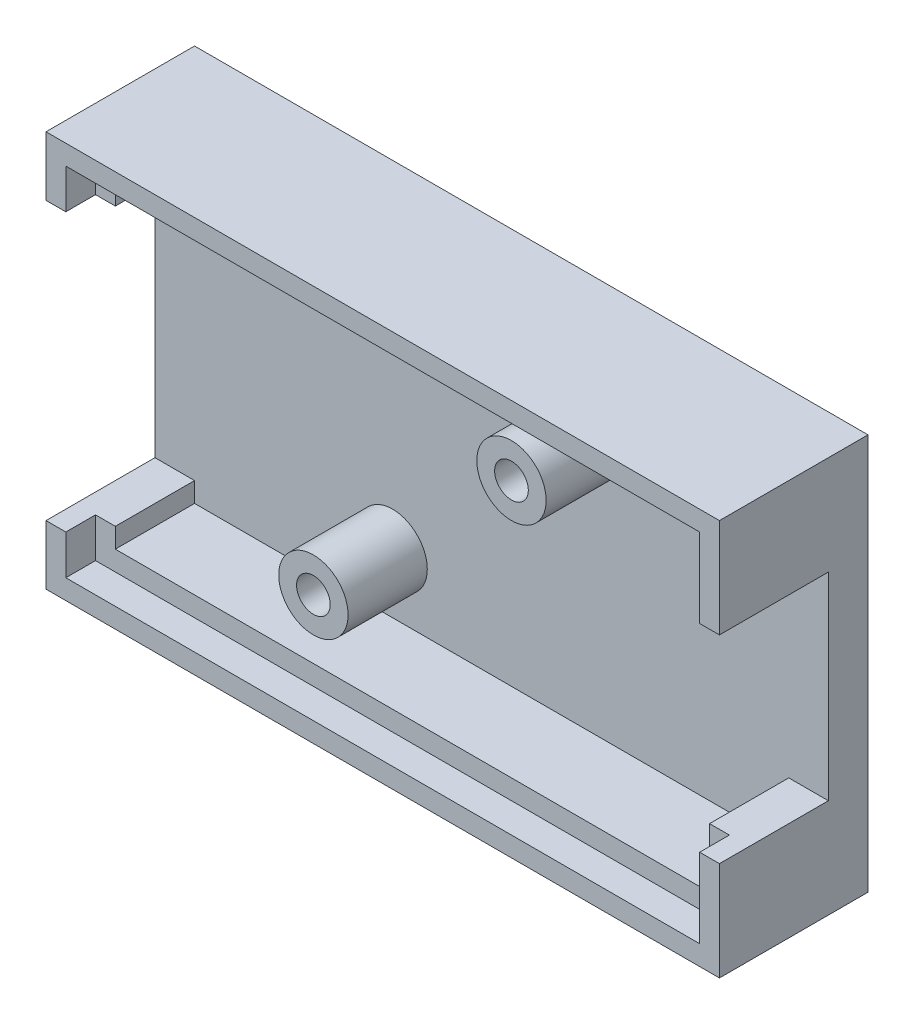
ISO-10303-21;
HEADER;
FILE_DESCRIPTION(('STEP AP214'),'2;1');
FILE_NAME('part.step','',(''),(''),'','','');
FILE_SCHEMA(('AUTOMOTIVE_DESIGN { 1 0 10303 214 1 1 1 1 }'));
ENDSEC;
DATA;
#1=APPLICATION_CONTEXT('core data for automotive mechanical design processes');
#2=APPLICATION_PROTOCOL_DEFINITION('international standard','automotive_design',2000,#1);
#3=PRODUCT_CONTEXT('',#1,'mechanical');
#4=PRODUCT('Part','Part','',(#3));
#5=PRODUCT_RELATED_PRODUCT_CATEGORY('part','',(#4));
#6=PRODUCT_DEFINITION_FORMATION('','',#4);
#7=PRODUCT_DEFINITION_CONTEXT('part definition',#1,'design');
#8=PRODUCT_DEFINITION('design','',#6,#7);
#9=PRODUCT_DEFINITION_SHAPE('','',#8);
#10=(LENGTH_UNIT() NAMED_UNIT(*) SI_UNIT(.MILLI.,.METRE.));
#11=(NAMED_UNIT(*) PLANE_ANGLE_UNIT() SI_UNIT($,.RADIAN.));
#12=(NAMED_UNIT(*) SI_UNIT($,.STERADIAN.) SOLID_ANGLE_UNIT());
#13=UNCERTAINTY_MEASURE_WITH_UNIT(LENGTH_MEASURE(1.E-05),#10,'distance_accuracy_value','');
#14=(GEOMETRIC_REPRESENTATION_CONTEXT(3) GLOBAL_UNCERTAINTY_ASSIGNED_CONTEXT((#13)) GLOBAL_UNIT_ASSIGNED_CONTEXT((#10,
#11,#12)) REPRESENTATION_CONTEXT('',''));
#15=CARTESIAN_POINT('',(0.,0.,0.));
#16=DIRECTION('',(0.,0.,1.));
#17=DIRECTION('',(1.,0.,0.));
#18=AXIS2_PLACEMENT_3D('',#15,#16,#17);
#19=CARTESIAN_POINT('',(0.,0.,7.5));
#20=DIRECTION('',(0.,0.,1.));
#21=DIRECTION('',(1.,0.,0.));
#22=AXIS2_PLACEMENT_3D('',#19,#20,#21);
#23=PLANE('',#22);
#24=DIRECTION('',(0.,1.,0.));
#25=VECTOR('',#24,1.);
#26=CARTESIAN_POINT('',(16.,-5.,7.5));
#27=LINE('',#26,#25);
#28=CARTESIAN_POINT('',(16.,-9.,7.5));
#29=VERTEX_POINT('',#28);
#30=CARTESIAN_POINT('',(16.,-5.,7.5));
#31=VERTEX_POINT('',#30);
#32=EDGE_CURVE('E440',#29,#31,#27,.T.);
#33=ORIENTED_EDGE('',*,*,#32,.F.);
#34=DIRECTION('',(1.,0.,0.));
#35=VECTOR('',#34,1.);
#36=CARTESIAN_POINT('',(16.,-9.,7.5));
#37=LINE('',#36,#35);
#38=CARTESIAN_POINT('',(-16.,-9.00000000000001,7.5));
#39=VERTEX_POINT('',#38);
#40=EDGE_CURVE('E446',#39,#29,#37,.T.);
#41=ORIENTED_EDGE('',*,*,#40,.F.);
#42=DIRECTION('',(0.,-1.,0.));
#43=VECTOR('',#42,1.);
#44=CARTESIAN_POINT('',(-16.,-9.00000000000001,7.5));
#45=LINE('',#44,#43);
#46=CARTESIAN_POINT('',(-16.,-7.,7.5));
#47=VERTEX_POINT('',#46);
#48=EDGE_CURVE('E469',#47,#39,#45,.T.);
#49=ORIENTED_EDGE('',*,*,#48,.F.);
#50=DIRECTION('',(-1.,0.,0.));
#51=VECTOR('',#50,1.);
#52=CARTESIAN_POINT('',(-15.,-7.,7.5));
#53=LINE('',#52,#51);
#54=CARTESIAN_POINT('',(-17.,-7.,7.5));
#55=VERTEX_POINT('',#54);
#56=EDGE_CURVE('E249',#47,#55,#53,.T.);
#57=ORIENTED_EDGE('',*,*,#56,.T.);
#58=DIRECTION('',(0.,-1.,0.));
#59=VECTOR('',#58,1.);
#60=CARTESIAN_POINT('',(-17.,10.,7.5));
#61=LINE('',#60,#59);
#62=CARTESIAN_POINT('',(-17.,-10.,7.5));
#63=VERTEX_POINT('',#62);
#64=EDGE_CURVE('E330',#55,#63,#61,.T.);
#65=ORIENTED_EDGE('',*,*,#64,.T.);
#66=DIRECTION('',(1.,0.,0.));
#67=VECTOR('',#66,1.);
#68=CARTESIAN_POINT('',(-17.,-10.,7.5));
#69=LINE('',#68,#67);
#70=CARTESIAN_POINT('',(17.,-10.,7.5));
#71=VERTEX_POINT('',#70);
#72=EDGE_CURVE('E335',#63,#71,#69,.T.);
#73=ORIENTED_EDGE('',*,*,#72,.T.);
#74=DIRECTION('',(0.,1.,0.));
#75=VECTOR('',#74,1.);
#76=CARTESIAN_POINT('',(17.,10.,7.5));
#77=LINE('',#76,#75);
#78=CARTESIAN_POINT('',(17.,-5.,7.5));
#79=VERTEX_POINT('',#78);
#80=EDGE_CURVE('E322',#71,#79,#77,.T.);
#81=ORIENTED_EDGE('',*,*,#80,.T.);
#82=DIRECTION('',(1.,0.,0.));
#83=VECTOR('',#82,1.);
#84=CARTESIAN_POINT('',(15.,-5.,7.5));
#85=LINE('',#84,#83);
#86=EDGE_CURVE('E268',#31,#79,#85,.T.);
#87=ORIENTED_EDGE('',*,*,#86,.F.);
#88=EDGE_LOOP('',(#33,#41,#49,#57,#65,#73,#81,#87));
#89=FACE_BOUND('',#88,.T.);
#90=ADVANCED_FACE('F39',(#89),#23,.T.);
#91=CARTESIAN_POINT('',(-15.,8.,2.));
#92=DIRECTION('',(-1.,0.,0.));
#93=DIRECTION('',(0.,-1.,0.));
#94=AXIS2_PLACEMENT_3D('',#91,#92,#93);
#95=PLANE('',#94);
#96=DIRECTION('',(0.,0.,1.));
#97=VECTOR('',#96,1.);
#98=CARTESIAN_POINT('',(-15.,-7.,7.5));
#99=LINE('',#98,#97);
#100=CARTESIAN_POINT('',(-15.,-7.,2.));
#101=VERTEX_POINT('',#100);
#102=CARTESIAN_POINT('',(-15.,-7.,6.));
#103=VERTEX_POINT('',#102);
#104=EDGE_CURVE('E227',#101,#103,#99,.T.);
#105=ORIENTED_EDGE('',*,*,#104,.T.);
#106=DIRECTION('',(0.,1.,0.));
#107=VECTOR('',#106,1.);
#108=CARTESIAN_POINT('',(-15.,-7.,6.));
#109=LINE('',#108,#107);
#110=CARTESIAN_POINT('',(-15.,-8.,6.));
#111=VERTEX_POINT('',#110);
#112=EDGE_CURVE('E55',#111,#103,#109,.T.);
#113=ORIENTED_EDGE('',*,*,#112,.F.);
#114=DIRECTION('',(0.,0.,1.));
#115=VECTOR('',#114,1.);
#116=CARTESIAN_POINT('',(-15.,-8.,2.));
#117=LINE('',#116,#115);
#118=CARTESIAN_POINT('',(-15.,-8.,2.));
#119=VERTEX_POINT('',#118);
#120=EDGE_CURVE('E307',#119,#111,#117,.T.);
#121=ORIENTED_EDGE('',*,*,#120,.F.);
#122=DIRECTION('',(0.,-1.,0.));
#123=VECTOR('',#122,1.);
#124=CARTESIAN_POINT('',(-15.,8.,2.));
#125=LINE('',#124,#123);
#126=EDGE_CURVE('E282',#101,#119,#125,.T.);
#127=ORIENTED_EDGE('',*,*,#126,.F.);
#128=EDGE_LOOP('',(#105,#113,#121,#127));
#129=FACE_BOUND('',#128,.T.);
#130=ADVANCED_FACE('F400',(#129),#95,.F.);
#131=CARTESIAN_POINT('',(15.,8.,2.));
#132=DIRECTION('',(1.,0.,0.));
#133=DIRECTION('',(0.,1.,0.));
#134=AXIS2_PLACEMENT_3D('',#131,#132,#133);
#135=PLANE('',#134);
#136=DIRECTION('',(0.,0.,1.));
#137=VECTOR('',#136,1.);
#138=CARTESIAN_POINT('',(15.,5.,7.5));
#139=LINE('',#138,#137);
#140=CARTESIAN_POINT('',(15.,5.,2.));
#141=VERTEX_POINT('',#140);
#142=CARTESIAN_POINT('',(15.,5.,6.));
#143=VERTEX_POINT('',#142);
#144=EDGE_CURVE('E263',#141,#143,#139,.T.);
#145=ORIENTED_EDGE('',*,*,#144,.T.);
#146=DIRECTION('',(0.,-1.,0.));
#147=VECTOR('',#146,1.);
#148=CARTESIAN_POINT('',(15.,8.,6.));
#149=LINE('',#148,#147);
#150=CARTESIAN_POINT('',(15.,8.,6.));
#151=VERTEX_POINT('',#150);
#152=EDGE_CURVE('E428',#151,#143,#149,.T.);
#153=ORIENTED_EDGE('',*,*,#152,.F.);
#154=DIRECTION('',(0.,0.,1.));
#155=VECTOR('',#154,1.);
#156=CARTESIAN_POINT('',(15.,8.,2.));
#157=LINE('',#156,#155);
#158=CARTESIAN_POINT('',(15.,8.,2.));
#159=VERTEX_POINT('',#158);
#160=EDGE_CURVE('E311',#159,#151,#157,.T.);
#161=ORIENTED_EDGE('',*,*,#160,.F.);
#162=DIRECTION('',(0.,1.,0.));
#163=VECTOR('',#162,1.);
#164=CARTESIAN_POINT('',(15.,8.,2.));
#165=LINE('',#164,#163);
#166=EDGE_CURVE('E298',#141,#159,#165,.T.);
#167=ORIENTED_EDGE('',*,*,#166,.F.);
#168=EDGE_LOOP('',(#145,#153,#161,#167));
#169=FACE_BOUND('',#168,.T.);
#170=ADVANCED_FACE('F425',(#169),#135,.F.);
#171=CARTESIAN_POINT('',(17.,10.,7.5));
#172=DIRECTION('',(-1.,0.,0.));
#173=DIRECTION('',(0.,0.,1.));
#174=AXIS2_PLACEMENT_3D('',#171,#172,#173);
#175=PLANE('',#174);
#176=CARTESIAN_POINT('',(17.,5.,7.5));
#177=VERTEX_POINT('',#176);
#178=CARTESIAN_POINT('',(17.,10.,7.5));
#179=VERTEX_POINT('',#178);
#180=EDGE_CURVE('E327',#177,#179,#77,.T.);
#181=ORIENTED_EDGE('',*,*,#180,.F.);
#182=DIRECTION('',(0.,0.,1.));
#183=VECTOR('',#182,1.);
#184=CARTESIAN_POINT('',(17.,5.,7.5));
#185=LINE('',#184,#183);
#186=CARTESIAN_POINT('',(17.,5.,2.));
#187=VERTEX_POINT('',#186);
#188=EDGE_CURVE('E264',#187,#177,#185,.T.);
#189=ORIENTED_EDGE('',*,*,#188,.F.);
#190=DIRECTION('',(0.,1.,0.));
#191=VECTOR('',#190,1.);
#192=CARTESIAN_POINT('',(17.,5.,2.));
#193=LINE('',#192,#191);
#194=CARTESIAN_POINT('',(17.,-5.,2.));
#195=VERTEX_POINT('',#194);
#196=EDGE_CURVE('E272',#195,#187,#193,.T.);
#197=ORIENTED_EDGE('',*,*,#196,.F.);
#198=DIRECTION('',(0.,0.,-1.));
#199=VECTOR('',#198,1.);
#200=CARTESIAN_POINT('',(17.,-5.,7.5));
#201=LINE('',#200,#199);
#202=EDGE_CURVE('E252',#79,#195,#201,.T.);
#203=ORIENTED_EDGE('',*,*,#202,.F.);
#204=ORIENTED_EDGE('',*,*,#80,.F.);
#205=DIRECTION('',(0.,0.,-1.));
#206=VECTOR('',#205,1.);
#207=CARTESIAN_POINT('',(17.,-10.,7.5));
#208=LINE('',#207,#206);
#209=CARTESIAN_POINT('',(17.,-10.,0.));
#210=VERTEX_POINT('',#209);
#211=EDGE_CURVE('E338',#71,#210,#208,.T.);
#212=ORIENTED_EDGE('',*,*,#211,.T.);
#213=DIRECTION('',(0.,1.,0.));
#214=VECTOR('',#213,1.);
#215=CARTESIAN_POINT('',(17.,10.,0.));
#216=LINE('',#215,#214);
#217=CARTESIAN_POINT('',(17.,10.,0.));
#218=VERTEX_POINT('',#217);
#219=EDGE_CURVE('E310',#210,#218,#216,.T.);
#220=ORIENTED_EDGE('',*,*,#219,.T.);
#221=DIRECTION('',(0.,0.,-1.));
#222=VECTOR('',#221,1.);
#223=CARTESIAN_POINT('',(17.,10.,7.5));
#224=LINE('',#223,#222);
#225=EDGE_CURVE('E11',#179,#218,#224,.T.);
#226=ORIENTED_EDGE('',*,*,#225,.F.);
#227=EDGE_LOOP('',(#181,#189,#197,#203,#204,#212,#220,#226));
#228=FACE_BOUND('',#227,.T.);
#229=ADVANCED_FACE('F41',(#228),#175,.F.);
#230=CARTESIAN_POINT('',(-17.,10.,7.5));
#231=DIRECTION('',(0.,-1.,0.));
#232=DIRECTION('',(0.,0.,-1.));
#233=AXIS2_PLACEMENT_3D('',#230,#231,#232);
#234=PLANE('',#233);
#235=DIRECTION('',(-1.,0.,0.));
#236=VECTOR('',#235,1.);
#237=CARTESIAN_POINT('',(-17.,10.,0.));
#238=LINE('',#237,#236);
#239=CARTESIAN_POINT('',(-17.,10.,0.));
#240=VERTEX_POINT('',#239);
#241=EDGE_CURVE('E342',#218,#240,#238,.T.);
#242=ORIENTED_EDGE('',*,*,#241,.T.);
#243=DIRECTION('',(0.,0.,-1.));
#244=VECTOR('',#243,1.);
#245=CARTESIAN_POINT('',(-17.,10.,7.5));
#246=LINE('',#245,#244);
#247=CARTESIAN_POINT('',(-17.,10.,7.5));
#248=VERTEX_POINT('',#247);
#249=EDGE_CURVE('E48',#248,#240,#246,.T.);
#250=ORIENTED_EDGE('',*,*,#249,.F.);
#251=DIRECTION('',(-1.,0.,0.));
#252=VECTOR('',#251,1.);
#253=CARTESIAN_POINT('',(-17.,10.,7.5));
#254=LINE('',#253,#252);
#255=EDGE_CURVE('E326',#179,#248,#254,.T.);
#256=ORIENTED_EDGE('',*,*,#255,.F.);
#257=ORIENTED_EDGE('',*,*,#225,.T.);
#258=EDGE_LOOP('',(#242,#250,#256,#257));
#259=FACE_BOUND('',#258,.T.);
#260=ADVANCED_FACE('F556',(#259),#234,.F.);
#261=CARTESIAN_POINT('',(-17.,10.,7.5));
#262=DIRECTION('',(1.,0.,0.));
#263=DIRECTION('',(0.,0.,-1.));
#264=AXIS2_PLACEMENT_3D('',#261,#262,#263);
#265=PLANE('',#264);
#266=ORIENTED_EDGE('',*,*,#64,.F.);
#267=DIRECTION('',(0.,0.,1.));
#268=VECTOR('',#267,1.);
#269=CARTESIAN_POINT('',(-17.,-7.,7.5));
#270=LINE('',#269,#268);
#271=CARTESIAN_POINT('',(-17.,-7.,2.));
#272=VERTEX_POINT('',#271);
#273=EDGE_CURVE('E228',#272,#55,#270,.T.);
#274=ORIENTED_EDGE('',*,*,#273,.F.);
#275=DIRECTION('',(0.,-1.,0.));
#276=VECTOR('',#275,1.);
#277=CARTESIAN_POINT('',(-17.,7.,2.));
#278=LINE('',#277,#276);
#279=CARTESIAN_POINT('',(-17.,7.,2.));
#280=VERTEX_POINT('',#279);
#281=EDGE_CURVE('E236',#280,#272,#278,.T.);
#282=ORIENTED_EDGE('',*,*,#281,.F.);
#283=DIRECTION('',(0.,0.,-1.));
#284=VECTOR('',#283,1.);
#285=CARTESIAN_POINT('',(-17.,7.,7.5));
#286=LINE('',#285,#284);
#287=CARTESIAN_POINT('',(-17.,7.,7.5));
#288=VERTEX_POINT('',#287);
#289=EDGE_CURVE('E242',#288,#280,#286,.T.);
#290=ORIENTED_EDGE('',*,*,#289,.F.);
#291=EDGE_CURVE('E331',#248,#288,#61,.T.);
#292=ORIENTED_EDGE('',*,*,#291,.F.);
#293=ORIENTED_EDGE('',*,*,#249,.T.);
#294=DIRECTION('',(0.,-1.,0.));
#295=VECTOR('',#294,1.);
#296=CARTESIAN_POINT('',(-17.,10.,0.));
#297=LINE('',#296,#295);
#298=CARTESIAN_POINT('',(-17.,-10.,0.));
#299=VERTEX_POINT('',#298);
#300=EDGE_CURVE('E345',#240,#299,#297,.T.);
#301=ORIENTED_EDGE('',*,*,#300,.T.);
#302=DIRECTION('',(0.,0.,-1.));
#303=VECTOR('',#302,1.);
#304=CARTESIAN_POINT('',(-17.,-10.,7.5));
#305=LINE('',#304,#303);
#306=EDGE_CURVE('E354',#63,#299,#305,.T.);
#307=ORIENTED_EDGE('',*,*,#306,.F.);
#308=EDGE_LOOP('',(#266,#274,#282,#290,#292,#293,#301,#307));
#309=FACE_BOUND('',#308,.T.);
#310=ADVANCED_FACE('F364',(#309),#265,.F.);
#311=CARTESIAN_POINT('',(-17.,-10.,7.5));
#312=DIRECTION('',(0.,1.,0.));
#313=DIRECTION('',(0.,0.,1.));
#314=AXIS2_PLACEMENT_3D('',#311,#312,#313);
#315=PLANE('',#314);
#316=DIRECTION('',(1.,0.,0.));
#317=VECTOR('',#316,1.);
#318=CARTESIAN_POINT('',(-17.,-10.,0.));
#319=LINE('',#318,#317);
#320=EDGE_CURVE('E348',#299,#210,#319,.T.);
#321=ORIENTED_EDGE('',*,*,#320,.T.);
#322=ORIENTED_EDGE('',*,*,#211,.F.);
#323=ORIENTED_EDGE('',*,*,#72,.F.);
#324=ORIENTED_EDGE('',*,*,#306,.T.);
#325=EDGE_LOOP('',(#321,#322,#323,#324));
#326=FACE_BOUND('',#325,.T.);
#327=ADVANCED_FACE('F375',(#326),#315,.F.);
#328=DIRECTION('',(0.,-1.,0.));
#329=VECTOR('',#328,1.);
#330=CARTESIAN_POINT('',(-16.,7.,7.5));
#331=LINE('',#330,#329);
#332=CARTESIAN_POINT('',(-16.,9.,7.5));
#333=VERTEX_POINT('',#332);
#334=CARTESIAN_POINT('',(-16.,7.,7.5));
#335=VERTEX_POINT('',#334);
#336=EDGE_CURVE('E210',#333,#335,#331,.T.);
#337=ORIENTED_EDGE('',*,*,#336,.F.);
#338=DIRECTION('',(-1.,0.,0.));
#339=VECTOR('',#338,1.);
#340=CARTESIAN_POINT('',(-16.,9.,7.5));
#341=LINE('',#340,#339);
#342=CARTESIAN_POINT('',(16.,9.,7.5));
#343=VERTEX_POINT('',#342);
#344=EDGE_CURVE('E528',#343,#333,#341,.T.);
#345=ORIENTED_EDGE('',*,*,#344,.F.);
#346=DIRECTION('',(0.,1.,0.));
#347=VECTOR('',#346,1.);
#348=CARTESIAN_POINT('',(16.,9.,7.5));
#349=LINE('',#348,#347);
#350=CARTESIAN_POINT('',(16.,5.,7.5));
#351=VERTEX_POINT('',#350);
#352=EDGE_CURVE('E480',#351,#343,#349,.T.);
#353=ORIENTED_EDGE('',*,*,#352,.F.);
#354=DIRECTION('',(1.,0.,0.));
#355=VECTOR('',#354,1.);
#356=CARTESIAN_POINT('',(15.,5.,7.5));
#357=LINE('',#356,#355);
#358=EDGE_CURVE('E279',#351,#177,#357,.T.);
#359=ORIENTED_EDGE('',*,*,#358,.T.);
#360=ORIENTED_EDGE('',*,*,#180,.T.);
#361=ORIENTED_EDGE('',*,*,#255,.T.);
#362=ORIENTED_EDGE('',*,*,#291,.T.);
#363=DIRECTION('',(-1.,0.,0.));
#364=VECTOR('',#363,1.);
#365=CARTESIAN_POINT('',(-15.,7.,7.5));
#366=LINE('',#365,#364);
#367=EDGE_CURVE('E233',#335,#288,#366,.T.);
#368=ORIENTED_EDGE('',*,*,#367,.F.);
#369=EDGE_LOOP('',(#337,#345,#353,#359,#360,#361,#362,#368));
#370=FACE_BOUND('',#369,.T.);
#371=ADVANCED_FACE('F511',(#370),#23,.T.);
#372=CARTESIAN_POINT('',(0.,0.,0.));
#373=DIRECTION('',(0.,0.,1.));
#374=DIRECTION('',(1.,0.,0.));
#375=AXIS2_PLACEMENT_3D('',#372,#373,#374);
#376=PLANE('',#375);
#377=ORIENTED_EDGE('',*,*,#219,.F.);
#378=ORIENTED_EDGE('',*,*,#320,.F.);
#379=ORIENTED_EDGE('',*,*,#300,.F.);
#380=ORIENTED_EDGE('',*,*,#241,.F.);
#381=EDGE_LOOP('',(#377,#378,#379,#380));
#382=FACE_BOUND('',#381,.T.);
#383=ADVANCED_FACE('F372',(#382),#376,.F.);
#384=DIRECTION('',(0.,0.,1.));
#385=VECTOR('',#384,1.);
#386=CARTESIAN_POINT('',(-15.,8.,2.));
#387=LINE('',#386,#385);
#388=CARTESIAN_POINT('',(-15.,8.,2.));
#389=VERTEX_POINT('',#388);
#390=CARTESIAN_POINT('',(-15.,8.,6.));
#391=VERTEX_POINT('',#390);
#392=EDGE_CURVE('E218',#389,#391,#387,.T.);
#393=ORIENTED_EDGE('',*,*,#392,.T.);
#394=DIRECTION('',(0.,1.,0.));
#395=VECTOR('',#394,1.);
#396=CARTESIAN_POINT('',(-15.,8.,6.));
#397=LINE('',#396,#395);
#398=CARTESIAN_POINT('',(-15.,7.,6.));
#399=VERTEX_POINT('',#398);
#400=EDGE_CURVE('E204',#399,#391,#397,.T.);
#401=ORIENTED_EDGE('',*,*,#400,.F.);
#402=DIRECTION('',(0.,0.,-1.));
#403=VECTOR('',#402,1.);
#404=CARTESIAN_POINT('',(-15.,7.,7.5));
#405=LINE('',#404,#403);
#406=CARTESIAN_POINT('',(-15.,7.,2.));
#407=VERTEX_POINT('',#406);
#408=EDGE_CURVE('E216',#399,#407,#405,.T.);
#409=ORIENTED_EDGE('',*,*,#408,.T.);
#410=EDGE_CURVE('E291',#389,#407,#125,.T.);
#411=ORIENTED_EDGE('',*,*,#410,.F.);
#412=EDGE_LOOP('',(#393,#401,#409,#411));
#413=FACE_BOUND('',#412,.T.);
#414=ADVANCED_FACE('F214',(#413),#95,.F.);
#415=CARTESIAN_POINT('',(-15.,8.,2.));
#416=DIRECTION('',(0.,1.,0.));
#417=DIRECTION('',(0.,0.,1.));
#418=AXIS2_PLACEMENT_3D('',#415,#416,#417);
#419=PLANE('',#418);
#420=ORIENTED_EDGE('',*,*,#160,.T.);
#421=DIRECTION('',(1.,0.,0.));
#422=VECTOR('',#421,1.);
#423=CARTESIAN_POINT('',(15.,8.,6.));
#424=LINE('',#423,#422);
#425=EDGE_CURVE('E220',#391,#151,#424,.T.);
#426=ORIENTED_EDGE('',*,*,#425,.F.);
#427=ORIENTED_EDGE('',*,*,#392,.F.);
#428=DIRECTION('',(-1.,0.,0.));
#429=VECTOR('',#428,1.);
#430=CARTESIAN_POINT('',(-15.,8.,2.));
#431=LINE('',#430,#429);
#432=EDGE_CURVE('E303',#159,#389,#431,.T.);
#433=ORIENTED_EDGE('',*,*,#432,.F.);
#434=EDGE_LOOP('',(#420,#426,#427,#433));
#435=FACE_BOUND('',#434,.T.);
#436=ADVANCED_FACE('F430',(#435),#419,.F.);
#437=DIRECTION('',(0.,0.,1.));
#438=VECTOR('',#437,1.);
#439=CARTESIAN_POINT('',(15.,-8.,2.));
#440=LINE('',#439,#438);
#441=CARTESIAN_POINT('',(15.,-8.,2.));
#442=VERTEX_POINT('',#441);
#443=CARTESIAN_POINT('',(15.,-8.,6.));
#444=VERTEX_POINT('',#443);
#445=EDGE_CURVE('E315',#442,#444,#440,.T.);
#446=ORIENTED_EDGE('',*,*,#445,.T.);
#447=DIRECTION('',(0.,-1.,0.));
#448=VECTOR('',#447,1.);
#449=CARTESIAN_POINT('',(15.,-5.,6.));
#450=LINE('',#449,#448);
#451=CARTESIAN_POINT('',(15.,-5.,6.));
#452=VERTEX_POINT('',#451);
#453=EDGE_CURVE('E462',#452,#444,#450,.T.);
#454=ORIENTED_EDGE('',*,*,#453,.F.);
#455=DIRECTION('',(0.,0.,-1.));
#456=VECTOR('',#455,1.);
#457=CARTESIAN_POINT('',(15.,-5.,7.5));
#458=LINE('',#457,#456);
#459=CARTESIAN_POINT('',(15.,-5.,2.));
#460=VERTEX_POINT('',#459);
#461=EDGE_CURVE('E260',#452,#460,#458,.T.);
#462=ORIENTED_EDGE('',*,*,#461,.T.);
#463=EDGE_CURVE('E299',#442,#460,#165,.T.);
#464=ORIENTED_EDGE('',*,*,#463,.F.);
#465=EDGE_LOOP('',(#446,#454,#462,#464));
#466=FACE_BOUND('',#465,.T.);
#467=ADVANCED_FACE('F408',(#466),#135,.F.);
#468=CARTESIAN_POINT('',(-15.,-8.,2.));
#469=DIRECTION('',(0.,-1.,0.));
#470=DIRECTION('',(0.,0.,-1.));
#471=AXIS2_PLACEMENT_3D('',#468,#469,#470);
#472=PLANE('',#471);
#473=ORIENTED_EDGE('',*,*,#120,.T.);
#474=DIRECTION('',(-1.,0.,0.));
#475=VECTOR('',#474,1.);
#476=CARTESIAN_POINT('',(-15.,-8.,6.));
#477=LINE('',#476,#475);
#478=EDGE_CURVE('E405',#444,#111,#477,.T.);
#479=ORIENTED_EDGE('',*,*,#478,.F.);
#480=ORIENTED_EDGE('',*,*,#445,.F.);
#481=DIRECTION('',(1.,0.,0.));
#482=VECTOR('',#481,1.);
#483=CARTESIAN_POINT('',(-15.,-8.,2.));
#484=LINE('',#483,#482);
#485=EDGE_CURVE('E294',#119,#442,#484,.T.);
#486=ORIENTED_EDGE('',*,*,#485,.F.);
#487=EDGE_LOOP('',(#473,#479,#480,#486));
#488=FACE_BOUND('',#487,.T.);
#489=ADVANCED_FACE('F403',(#488),#472,.F.);
#490=CARTESIAN_POINT('',(0.,0.,2.));
#491=DIRECTION('',(0.,0.,1.));
#492=DIRECTION('',(1.,0.,0.));
#493=AXIS2_PLACEMENT_3D('',#490,#491,#492);
#494=PLANE('',#493);
#495=CARTESIAN_POINT('',(-5.00000000000001,-5.,2.));
#496=DIRECTION('',(0.,0.,1.));
#497=DIRECTION('',(1.,0.,0.));
#498=AXIS2_PLACEMENT_3D('',#495,#496,#497);
#499=CIRCLE('',#498,1.75);
#500=CARTESIAN_POINT('',(-3.25000000000001,-5.,2.));
#501=VERTEX_POINT('',#500);
#502=EDGE_CURVE('E628',#501,#501,#499,.T.);
#503=ORIENTED_EDGE('',*,*,#502,.F.);
#504=EDGE_LOOP('',(#503));
#505=FACE_BOUND('',#504,.T.);
#506=CARTESIAN_POINT('',(4.99999999999999,5.,2.));
#507=DIRECTION('',(0.,0.,1.));
#508=DIRECTION('',(1.,0.,0.));
#509=AXIS2_PLACEMENT_3D('',#506,#507,#508);
#510=CIRCLE('',#509,1.75);
#511=CARTESIAN_POINT('',(6.74999999999999,5.,2.));
#512=VERTEX_POINT('',#511);
#513=EDGE_CURVE('E620',#512,#512,#510,.T.);
#514=ORIENTED_EDGE('',*,*,#513,.F.);
#515=EDGE_LOOP('',(#514));
#516=FACE_BOUND('',#515,.T.);
#517=ORIENTED_EDGE('',*,*,#410,.T.);
#518=DIRECTION('',(-1.,0.,0.));
#519=VECTOR('',#518,1.);
#520=CARTESIAN_POINT('',(-15.,7.,2.));
#521=LINE('',#520,#519);
#522=EDGE_CURVE('E224',#407,#280,#521,.T.);
#523=ORIENTED_EDGE('',*,*,#522,.T.);
#524=ORIENTED_EDGE('',*,*,#281,.T.);
#525=DIRECTION('',(-1.,0.,0.));
#526=VECTOR('',#525,1.);
#527=CARTESIAN_POINT('',(-15.,-7.,2.));
#528=LINE('',#527,#526);
#529=EDGE_CURVE('E253',#101,#272,#528,.T.);
#530=ORIENTED_EDGE('',*,*,#529,.F.);
#531=ORIENTED_EDGE('',*,*,#126,.T.);
#532=ORIENTED_EDGE('',*,*,#485,.T.);
#533=ORIENTED_EDGE('',*,*,#463,.T.);
#534=DIRECTION('',(1.,0.,0.));
#535=VECTOR('',#534,1.);
#536=CARTESIAN_POINT('',(15.,-5.,2.));
#537=LINE('',#536,#535);
#538=EDGE_CURVE('E286',#460,#195,#537,.T.);
#539=ORIENTED_EDGE('',*,*,#538,.T.);
#540=ORIENTED_EDGE('',*,*,#196,.T.);
#541=DIRECTION('',(1.,0.,0.));
#542=VECTOR('',#541,1.);
#543=CARTESIAN_POINT('',(15.,5.,2.));
#544=LINE('',#543,#542);
#545=EDGE_CURVE('E283',#141,#187,#544,.T.);
#546=ORIENTED_EDGE('',*,*,#545,.F.);
#547=ORIENTED_EDGE('',*,*,#166,.T.);
#548=ORIENTED_EDGE('',*,*,#432,.T.);
#549=EDGE_LOOP('',(#517,#523,#524,#530,#531,#532,#533,#539,#540,#546,#547,#548));
#550=FACE_BOUND('',#549,.T.);
#551=ADVANCED_FACE('F397',(#505,#516,#550),#494,.T.);
#552=CARTESIAN_POINT('',(15.,5.,7.5));
#553=DIRECTION('',(0.,1.,0.));
#554=DIRECTION('',(0.,0.,1.));
#555=AXIS2_PLACEMENT_3D('',#552,#553,#554);
#556=PLANE('',#555);
#557=ORIENTED_EDGE('',*,*,#358,.F.);
#558=DIRECTION('',(0.,0.,1.));
#559=VECTOR('',#558,1.);
#560=CARTESIAN_POINT('',(16.,5.,6.));
#561=LINE('',#560,#559);
#562=CARTESIAN_POINT('',(16.,5.,6.));
#563=VERTEX_POINT('',#562);
#564=EDGE_CURVE('E449',#563,#351,#561,.T.);
#565=ORIENTED_EDGE('',*,*,#564,.F.);
#566=DIRECTION('',(1.,0.,0.));
#567=VECTOR('',#566,1.);
#568=CARTESIAN_POINT('',(15.,5.,6.));
#569=LINE('',#568,#567);
#570=EDGE_CURVE('E611',#143,#563,#569,.T.);
#571=ORIENTED_EDGE('',*,*,#570,.F.);
#572=ORIENTED_EDGE('',*,*,#144,.F.);
#573=ORIENTED_EDGE('',*,*,#545,.T.);
#574=ORIENTED_EDGE('',*,*,#188,.T.);
#575=EDGE_LOOP('',(#557,#565,#571,#572,#573,#574));
#576=FACE_BOUND('',#575,.T.);
#577=ADVANCED_FACE('F419',(#576),#556,.F.);
#578=CARTESIAN_POINT('',(15.,-5.,7.5));
#579=DIRECTION('',(0.,-1.,0.));
#580=DIRECTION('',(0.,0.,-1.));
#581=AXIS2_PLACEMENT_3D('',#578,#579,#580);
#582=PLANE('',#581);
#583=DIRECTION('',(-1.,0.,0.));
#584=VECTOR('',#583,1.);
#585=CARTESIAN_POINT('',(16.,-5.,6.));
#586=LINE('',#585,#584);
#587=CARTESIAN_POINT('',(16.,-5.,6.));
#588=VERTEX_POINT('',#587);
#589=EDGE_CURVE('E459',#588,#452,#586,.T.);
#590=ORIENTED_EDGE('',*,*,#589,.F.);
#591=DIRECTION('',(0.,0.,1.));
#592=VECTOR('',#591,1.);
#593=CARTESIAN_POINT('',(16.,-5.,6.));
#594=LINE('',#593,#592);
#595=EDGE_CURVE('E477',#588,#31,#594,.T.);
#596=ORIENTED_EDGE('',*,*,#595,.T.);
#597=ORIENTED_EDGE('',*,*,#86,.T.);
#598=ORIENTED_EDGE('',*,*,#202,.T.);
#599=ORIENTED_EDGE('',*,*,#538,.F.);
#600=ORIENTED_EDGE('',*,*,#461,.F.);
#601=EDGE_LOOP('',(#590,#596,#597,#598,#599,#600));
#602=FACE_BOUND('',#601,.T.);
#603=ADVANCED_FACE('F415',(#602),#582,.F.);
#604=CARTESIAN_POINT('',(-15.,-7.,7.5));
#605=DIRECTION('',(0.,-1.,0.));
#606=DIRECTION('',(0.,0.,-1.));
#607=AXIS2_PLACEMENT_3D('',#604,#605,#606);
#608=PLANE('',#607);
#609=ORIENTED_EDGE('',*,*,#56,.F.);
#610=DIRECTION('',(0.,0.,1.));
#611=VECTOR('',#610,1.);
#612=CARTESIAN_POINT('',(-16.,-7.,6.));
#613=LINE('',#612,#611);
#614=CARTESIAN_POINT('',(-16.,-7.,6.));
#615=VERTEX_POINT('',#614);
#616=EDGE_CURVE('E239',#615,#47,#613,.T.);
#617=ORIENTED_EDGE('',*,*,#616,.F.);
#618=DIRECTION('',(-1.,0.,0.));
#619=VECTOR('',#618,1.);
#620=CARTESIAN_POINT('',(-16.,-7.,6.));
#621=LINE('',#620,#619);
#622=EDGE_CURVE('E436',#103,#615,#621,.T.);
#623=ORIENTED_EDGE('',*,*,#622,.F.);
#624=ORIENTED_EDGE('',*,*,#104,.F.);
#625=ORIENTED_EDGE('',*,*,#529,.T.);
#626=ORIENTED_EDGE('',*,*,#273,.T.);
#627=EDGE_LOOP('',(#609,#617,#623,#624,#625,#626));
#628=FACE_BOUND('',#627,.T.);
#629=ADVANCED_FACE('F434',(#628),#608,.F.);
#630=CARTESIAN_POINT('',(-15.,7.,7.5));
#631=DIRECTION('',(0.,1.,0.));
#632=DIRECTION('',(0.,0.,1.));
#633=AXIS2_PLACEMENT_3D('',#630,#631,#632);
#634=PLANE('',#633);
#635=DIRECTION('',(1.,0.,0.));
#636=VECTOR('',#635,1.);
#637=CARTESIAN_POINT('',(-15.,7.,6.));
#638=LINE('',#637,#636);
#639=CARTESIAN_POINT('',(-16.,7.,6.));
#640=VERTEX_POINT('',#639);
#641=EDGE_CURVE('E201',#640,#399,#638,.T.);
#642=ORIENTED_EDGE('',*,*,#641,.F.);
#643=DIRECTION('',(0.,0.,1.));
#644=VECTOR('',#643,1.);
#645=CARTESIAN_POINT('',(-16.,7.,6.));
#646=LINE('',#645,#644);
#647=EDGE_CURVE('E245',#640,#335,#646,.T.);
#648=ORIENTED_EDGE('',*,*,#647,.T.);
#649=ORIENTED_EDGE('',*,*,#367,.T.);
#650=ORIENTED_EDGE('',*,*,#289,.T.);
#651=ORIENTED_EDGE('',*,*,#522,.F.);
#652=ORIENTED_EDGE('',*,*,#408,.F.);
#653=EDGE_LOOP('',(#642,#648,#649,#650,#651,#652));
#654=FACE_BOUND('',#653,.T.);
#655=ADVANCED_FACE('F222',(#654),#634,.F.);
#656=CARTESIAN_POINT('',(-16.,7.,6.));
#657=DIRECTION('',(-1.,0.,0.));
#658=DIRECTION('',(0.,0.,1.));
#659=AXIS2_PLACEMENT_3D('',#656,#657,#658);
#660=PLANE('',#659);
#661=ORIENTED_EDGE('',*,*,#336,.T.);
#662=ORIENTED_EDGE('',*,*,#647,.F.);
#663=DIRECTION('',(0.,-1.,0.));
#664=VECTOR('',#663,1.);
#665=CARTESIAN_POINT('',(-16.,7.,6.));
#666=LINE('',#665,#664);
#667=CARTESIAN_POINT('',(-16.,9.,6.));
#668=VERTEX_POINT('',#667);
#669=EDGE_CURVE('E63',#668,#640,#666,.T.);
#670=ORIENTED_EDGE('',*,*,#669,.F.);
#671=DIRECTION('',(0.,0.,1.));
#672=VECTOR('',#671,1.);
#673=CARTESIAN_POINT('',(-16.,9.,6.));
#674=LINE('',#673,#672);
#675=EDGE_CURVE('E538',#668,#333,#674,.T.);
#676=ORIENTED_EDGE('',*,*,#675,.T.);
#677=EDGE_LOOP('',(#661,#662,#670,#676));
#678=FACE_BOUND('',#677,.T.);
#679=ADVANCED_FACE('F589',(#678),#660,.F.);
#680=CARTESIAN_POINT('',(-16.,9.,6.));
#681=DIRECTION('',(0.,1.,0.));
#682=DIRECTION('',(0.,0.,1.));
#683=AXIS2_PLACEMENT_3D('',#680,#681,#682);
#684=PLANE('',#683);
#685=ORIENTED_EDGE('',*,*,#344,.T.);
#686=ORIENTED_EDGE('',*,*,#675,.F.);
#687=DIRECTION('',(-1.,0.,0.));
#688=VECTOR('',#687,1.);
#689=CARTESIAN_POINT('',(-16.,9.,6.));
#690=LINE('',#689,#688);
#691=CARTESIAN_POINT('',(16.,9.,6.));
#692=VERTEX_POINT('',#691);
#693=EDGE_CURVE('E548',#692,#668,#690,.T.);
#694=ORIENTED_EDGE('',*,*,#693,.F.);
#695=DIRECTION('',(0.,0.,1.));
#696=VECTOR('',#695,1.);
#697=CARTESIAN_POINT('',(16.,9.,6.));
#698=LINE('',#697,#696);
#699=EDGE_CURVE('E540',#692,#343,#698,.T.);
#700=ORIENTED_EDGE('',*,*,#699,.T.);
#701=EDGE_LOOP('',(#685,#686,#694,#700));
#702=FACE_BOUND('',#701,.T.);
#703=ADVANCED_FACE('F601',(#702),#684,.F.);
#704=CARTESIAN_POINT('',(16.,9.,6.));
#705=DIRECTION('',(1.,0.,0.));
#706=DIRECTION('',(0.,0.,-1.));
#707=AXIS2_PLACEMENT_3D('',#704,#705,#706);
#708=PLANE('',#707);
#709=ORIENTED_EDGE('',*,*,#352,.T.);
#710=ORIENTED_EDGE('',*,*,#699,.F.);
#711=DIRECTION('',(0.,1.,0.));
#712=VECTOR('',#711,1.);
#713=CARTESIAN_POINT('',(16.,9.,6.));
#714=LINE('',#713,#712);
#715=EDGE_CURVE('E551',#563,#692,#714,.T.);
#716=ORIENTED_EDGE('',*,*,#715,.F.);
#717=ORIENTED_EDGE('',*,*,#564,.T.);
#718=EDGE_LOOP('',(#709,#710,#716,#717));
#719=FACE_BOUND('',#718,.T.);
#720=ADVANCED_FACE('F555',(#719),#708,.F.);
#721=CARTESIAN_POINT('',(0.,0.,6.));
#722=DIRECTION('',(0.,0.,-1.));
#723=DIRECTION('',(-1.,0.,0.));
#724=AXIS2_PLACEMENT_3D('',#721,#722,#723);
#725=PLANE('',#724);
#726=ORIENTED_EDGE('',*,*,#641,.T.);
#727=ORIENTED_EDGE('',*,*,#400,.T.);
#728=ORIENTED_EDGE('',*,*,#425,.T.);
#729=ORIENTED_EDGE('',*,*,#152,.T.);
#730=ORIENTED_EDGE('',*,*,#570,.T.);
#731=ORIENTED_EDGE('',*,*,#715,.T.);
#732=ORIENTED_EDGE('',*,*,#693,.T.);
#733=ORIENTED_EDGE('',*,*,#669,.T.);
#734=EDGE_LOOP('',(#726,#727,#728,#729,#730,#731,#732,#733));
#735=FACE_BOUND('',#734,.T.);
#736=ADVANCED_FACE('F203',(#735),#725,.F.);
#737=CARTESIAN_POINT('',(16.,-5.,6.));
#738=DIRECTION('',(1.,0.,0.));
#739=DIRECTION('',(0.,0.,-1.));
#740=AXIS2_PLACEMENT_3D('',#737,#738,#739);
#741=PLANE('',#740);
#742=ORIENTED_EDGE('',*,*,#32,.T.);
#743=ORIENTED_EDGE('',*,*,#595,.F.);
#744=DIRECTION('',(0.,1.,0.));
#745=VECTOR('',#744,1.);
#746=CARTESIAN_POINT('',(16.,-5.,6.));
#747=LINE('',#746,#745);
#748=CARTESIAN_POINT('',(16.,-9.,6.));
#749=VERTEX_POINT('',#748);
#750=EDGE_CURVE('E455',#749,#588,#747,.T.);
#751=ORIENTED_EDGE('',*,*,#750,.F.);
#752=DIRECTION('',(0.,0.,1.));
#753=VECTOR('',#752,1.);
#754=CARTESIAN_POINT('',(16.,-9.,6.));
#755=LINE('',#754,#753);
#756=EDGE_CURVE('E481',#749,#29,#755,.T.);
#757=ORIENTED_EDGE('',*,*,#756,.T.);
#758=EDGE_LOOP('',(#742,#743,#751,#757));
#759=FACE_BOUND('',#758,.T.);
#760=ADVANCED_FACE('F494',(#759),#741,.F.);
#761=CARTESIAN_POINT('',(16.,-9.,6.));
#762=DIRECTION('',(0.,-1.,0.));
#763=DIRECTION('',(1.,0.,0.));
#764=AXIS2_PLACEMENT_3D('',#761,#762,#763);
#765=PLANE('',#764);
#766=ORIENTED_EDGE('',*,*,#40,.T.);
#767=ORIENTED_EDGE('',*,*,#756,.F.);
#768=DIRECTION('',(1.,0.,0.));
#769=VECTOR('',#768,1.);
#770=CARTESIAN_POINT('',(16.,-9.,6.));
#771=LINE('',#770,#769);
#772=CARTESIAN_POINT('',(-16.,-9.00000000000001,6.));
#773=VERTEX_POINT('',#772);
#774=EDGE_CURVE('E444',#773,#749,#771,.T.);
#775=ORIENTED_EDGE('',*,*,#774,.F.);
#776=DIRECTION('',(0.,0.,1.));
#777=VECTOR('',#776,1.);
#778=CARTESIAN_POINT('',(-16.,-9.00000000000001,6.));
#779=LINE('',#778,#777);
#780=EDGE_CURVE('E483',#773,#39,#779,.T.);
#781=ORIENTED_EDGE('',*,*,#780,.T.);
#782=EDGE_LOOP('',(#766,#767,#775,#781));
#783=FACE_BOUND('',#782,.T.);
#784=ADVANCED_FACE('F491',(#783),#765,.F.);
#785=CARTESIAN_POINT('',(-16.,-9.00000000000001,6.));
#786=DIRECTION('',(-1.,0.,0.));
#787=DIRECTION('',(0.,0.,1.));
#788=AXIS2_PLACEMENT_3D('',#785,#786,#787);
#789=PLANE('',#788);
#790=ORIENTED_EDGE('',*,*,#48,.T.);
#791=ORIENTED_EDGE('',*,*,#780,.F.);
#792=DIRECTION('',(0.,-1.,0.));
#793=VECTOR('',#792,1.);
#794=CARTESIAN_POINT('',(-16.,-9.00000000000001,6.));
#795=LINE('',#794,#793);
#796=EDGE_CURVE('E439',#615,#773,#795,.T.);
#797=ORIENTED_EDGE('',*,*,#796,.F.);
#798=ORIENTED_EDGE('',*,*,#616,.T.);
#799=EDGE_LOOP('',(#790,#791,#797,#798));
#800=FACE_BOUND('',#799,.T.);
#801=ADVANCED_FACE('F489',(#800),#789,.F.);
#802=CARTESIAN_POINT('',(0.,0.,6.));
#803=DIRECTION('',(0.,0.,-1.));
#804=DIRECTION('',(-1.,0.,0.));
#805=AXIS2_PLACEMENT_3D('',#802,#803,#804);
#806=PLANE('',#805);
#807=ORIENTED_EDGE('',*,*,#622,.T.);
#808=ORIENTED_EDGE('',*,*,#796,.T.);
#809=ORIENTED_EDGE('',*,*,#774,.T.);
#810=ORIENTED_EDGE('',*,*,#750,.T.);
#811=ORIENTED_EDGE('',*,*,#589,.T.);
#812=ORIENTED_EDGE('',*,*,#453,.T.);
#813=ORIENTED_EDGE('',*,*,#478,.T.);
#814=ORIENTED_EDGE('',*,*,#112,.T.);
#815=EDGE_LOOP('',(#807,#808,#809,#810,#811,#812,#813,#814));
#816=FACE_BOUND('',#815,.T.);
#817=ADVANCED_FACE('F495',(#816),#806,.F.);
#818=CARTESIAN_POINT('',(4.99999999999999,5.,6.));
#819=DIRECTION('',(0.,0.,-1.));
#820=DIRECTION('',(-1.,0.,0.));
#821=AXIS2_PLACEMENT_3D('',#818,#819,#820);
#822=CYLINDRICAL_SURFACE('',#821,1.75);
#823=CARTESIAN_POINT('',(4.99999999999999,5.,6.));
#824=DIRECTION('',(0.,0.,1.));
#825=DIRECTION('',(1.,0.,0.));
#826=AXIS2_PLACEMENT_3D('',#823,#824,#825);
#827=CIRCLE('',#826,1.75);
#828=CARTESIAN_POINT('',(6.74999999999999,5.,6.));
#829=VERTEX_POINT('',#828);
#830=EDGE_CURVE('E473',#829,#829,#827,.T.);
#831=ORIENTED_EDGE('',*,*,#830,.F.);
#832=EDGE_LOOP('',(#831));
#833=FACE_BOUND('',#832,.T.);
#834=ORIENTED_EDGE('',*,*,#513,.T.);
#835=EDGE_LOOP('',(#834));
#836=FACE_BOUND('',#835,.T.);
#837=ADVANCED_FACE('F497',(#833,#836),#822,.T.);
#838=CARTESIAN_POINT('',(4.99999999999999,5.,6.));
#839=DIRECTION('',(0.,0.,1.));
#840=DIRECTION('',(1.,0.,0.));
#841=AXIS2_PLACEMENT_3D('',#838,#839,#840);
#842=PLANE('',#841);
#843=CARTESIAN_POINT('',(4.99999999999999,5.,6.));
#844=DIRECTION('',(0.,0.,1.));
#845=DIRECTION('',(1.,0.,0.));
#846=AXIS2_PLACEMENT_3D('',#843,#844,#845);
#847=CIRCLE('',#846,0.85);
#848=CARTESIAN_POINT('',(5.84999999999999,5.,6.));
#849=VERTEX_POINT('',#848);
#850=EDGE_CURVE('E636',#849,#849,#847,.T.);
#851=ORIENTED_EDGE('',*,*,#850,.F.);
#852=EDGE_LOOP('',(#851));
#853=FACE_BOUND('',#852,.T.);
#854=ORIENTED_EDGE('',*,*,#830,.T.);
#855=EDGE_LOOP('',(#854));
#856=FACE_BOUND('',#855,.T.);
#857=ADVANCED_FACE('F503',(#853,#856),#842,.T.);
#858=CARTESIAN_POINT('',(-5.00000000000001,-5.,6.));
#859=DIRECTION('',(0.,0.,-1.));
#860=DIRECTION('',(-1.,0.,0.));
#861=AXIS2_PLACEMENT_3D('',#858,#859,#860);
#862=CYLINDRICAL_SURFACE('',#861,1.75);
#863=CARTESIAN_POINT('',(-5.00000000000001,-5.,6.));
#864=DIRECTION('',(0.,0.,1.));
#865=DIRECTION('',(1.,0.,0.));
#866=AXIS2_PLACEMENT_3D('',#863,#864,#865);
#867=CIRCLE('',#866,1.75);
#868=CARTESIAN_POINT('',(-3.25000000000001,-5.,6.));
#869=VERTEX_POINT('',#868);
#870=EDGE_CURVE('E624',#869,#869,#867,.T.);
#871=ORIENTED_EDGE('',*,*,#870,.F.);
#872=EDGE_LOOP('',(#871));
#873=FACE_BOUND('',#872,.T.);
#874=ORIENTED_EDGE('',*,*,#502,.T.);
#875=EDGE_LOOP('',(#874));
#876=FACE_BOUND('',#875,.T.);
#877=ADVANCED_FACE('F663',(#873,#876),#862,.T.);
#878=CARTESIAN_POINT('',(-5.00000000000001,-5.,6.));
#879=DIRECTION('',(0.,0.,1.));
#880=DIRECTION('',(1.,0.,0.));
#881=AXIS2_PLACEMENT_3D('',#878,#879,#880);
#882=PLANE('',#881);
#883=CARTESIAN_POINT('',(-5.00000000000001,-5.,6.));
#884=DIRECTION('',(0.,0.,1.));
#885=DIRECTION('',(1.,0.,0.));
#886=AXIS2_PLACEMENT_3D('',#883,#884,#885);
#887=CIRCLE('',#886,0.85);
#888=CARTESIAN_POINT('',(-4.15000000000001,-5.,6.));
#889=VERTEX_POINT('',#888);
#890=EDGE_CURVE('E644',#889,#889,#887,.T.);
#891=ORIENTED_EDGE('',*,*,#890,.F.);
#892=EDGE_LOOP('',(#891));
#893=FACE_BOUND('',#892,.T.);
#894=ORIENTED_EDGE('',*,*,#870,.T.);
#895=EDGE_LOOP('',(#894));
#896=FACE_BOUND('',#895,.T.);
#897=ADVANCED_FACE('F657',(#893,#896),#882,.T.);
#898=CARTESIAN_POINT('',(-5.00000000000001,-5.,3.));
#899=DIRECTION('',(0.,0.,1.));
#900=DIRECTION('',(1.,0.,0.));
#901=AXIS2_PLACEMENT_3D('',#898,#899,#900);
#902=CYLINDRICAL_SURFACE('',#901,0.85);
#903=CARTESIAN_POINT('',(-5.00000000000001,-5.,3.));
#904=DIRECTION('',(0.,0.,1.));
#905=DIRECTION('',(1.,0.,0.));
#906=AXIS2_PLACEMENT_3D('',#903,#904,#905);
#907=CIRCLE('',#906,0.85);
#908=CARTESIAN_POINT('',(-4.15000000000001,-5.,3.));
#909=VERTEX_POINT('',#908);
#910=EDGE_CURVE('E632',#909,#909,#907,.T.);
#911=ORIENTED_EDGE('',*,*,#910,.F.);
#912=EDGE_LOOP('',(#911));
#913=FACE_BOUND('',#912,.T.);
#914=ORIENTED_EDGE('',*,*,#890,.T.);
#915=EDGE_LOOP('',(#914));
#916=FACE_BOUND('',#915,.T.);
#917=ADVANCED_FACE('F654',(#913,#916),#902,.F.);
#918=CARTESIAN_POINT('',(-5.00000000000001,-5.,3.));
#919=DIRECTION('',(0.,0.,1.));
#920=DIRECTION('',(1.,0.,0.));
#921=AXIS2_PLACEMENT_3D('',#918,#919,#920);
#922=PLANE('',#921);
#923=ORIENTED_EDGE('',*,*,#910,.T.);
#924=EDGE_LOOP('',(#923));
#925=FACE_BOUND('',#924,.T.);
#926=ADVANCED_FACE('F652',(#925),#922,.T.);
#927=CARTESIAN_POINT('',(4.99999999999999,5.,3.));
#928=DIRECTION('',(0.,0.,1.));
#929=DIRECTION('',(1.,0.,0.));
#930=AXIS2_PLACEMENT_3D('',#927,#928,#929);
#931=CYLINDRICAL_SURFACE('',#930,0.85);
#932=CARTESIAN_POINT('',(4.99999999999999,5.,3.));
#933=DIRECTION('',(0.,0.,1.));
#934=DIRECTION('',(1.,0.,0.));
#935=AXIS2_PLACEMENT_3D('',#932,#933,#934);
#936=CIRCLE('',#935,0.85);
#937=CARTESIAN_POINT('',(5.84999999999999,5.,3.));
#938=VERTEX_POINT('',#937);
#939=EDGE_CURVE('E640',#938,#938,#936,.T.);
#940=ORIENTED_EDGE('',*,*,#939,.F.);
#941=EDGE_LOOP('',(#940));
#942=FACE_BOUND('',#941,.T.);
#943=ORIENTED_EDGE('',*,*,#850,.T.);
#944=EDGE_LOOP('',(#943));
#945=FACE_BOUND('',#944,.T.);
#946=ADVANCED_FACE('F679',(#942,#945),#931,.F.);
#947=CARTESIAN_POINT('',(4.99999999999999,5.,3.));
#948=DIRECTION('',(0.,0.,1.));
#949=DIRECTION('',(1.,0.,0.));
#950=AXIS2_PLACEMENT_3D('',#947,#948,#949);
#951=PLANE('',#950);
#952=ORIENTED_EDGE('',*,*,#939,.T.);
#953=EDGE_LOOP('',(#952));
#954=FACE_BOUND('',#953,.T.);
#955=ADVANCED_FACE('F682',(#954),#951,.T.);
#956=CLOSED_SHELL('',(#90,#130,#170,#229,#260,#310,#327,#371,#383,#414,#436,#467,#489,#551,#577,
#603,#629,#655,#679,#703,#720,#736,#760,#784,#801,#817,#837,#857,#877,#897,#917,#926,#946,#955));
#957=MANIFOLD_SOLID_BREP('B2',#956);
#958=ADVANCED_BREP_SHAPE_REPRESENTATION('',(#18,#957),#14);
#959=SHAPE_DEFINITION_REPRESENTATION(#9,#958);
ENDSEC;
END-ISO-10303-21;
